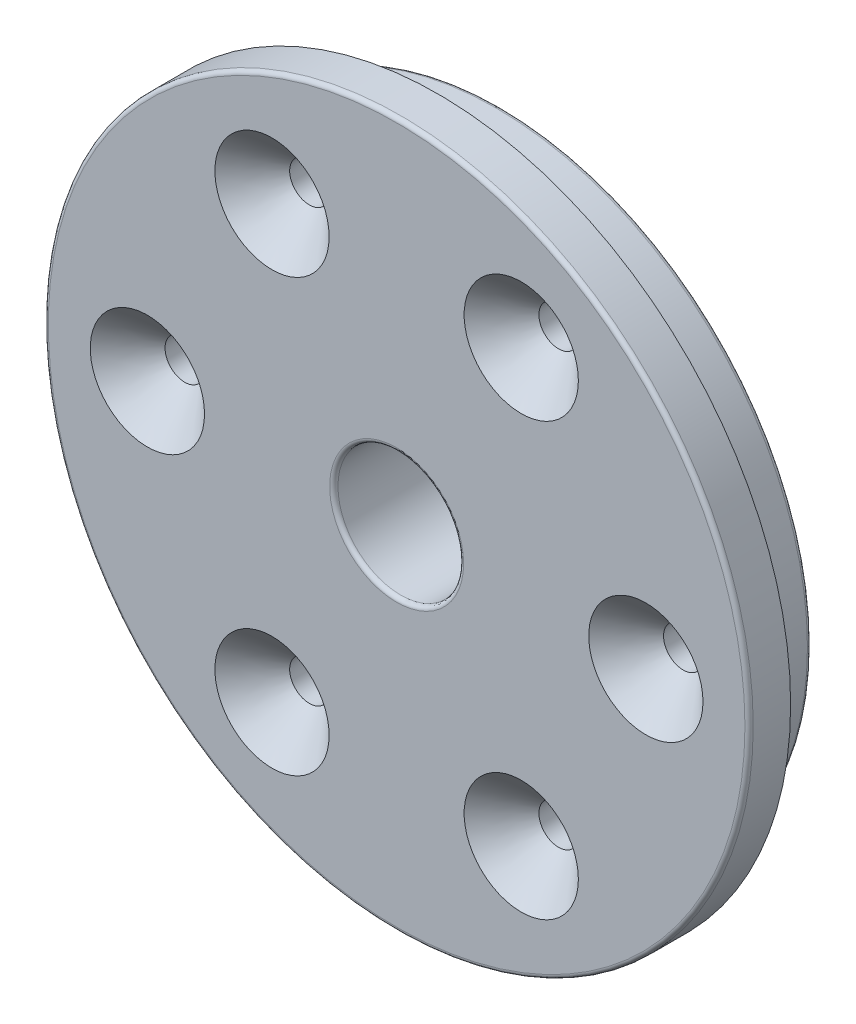
ISO-10303-21;
HEADER;
FILE_DESCRIPTION(('STEP AP214'),'2;1');
FILE_NAME('part.step','',(''),(''),'','','');
FILE_SCHEMA(('AUTOMOTIVE_DESIGN { 1 0 10303 214 1 1 1 1 }'));
ENDSEC;
DATA;
#1=APPLICATION_CONTEXT('core data for automotive mechanical design processes');
#2=APPLICATION_PROTOCOL_DEFINITION('international standard','automotive_design',2000,#1);
#3=PRODUCT_CONTEXT('',#1,'mechanical');
#4=PRODUCT('Part','Part','',(#3));
#5=PRODUCT_RELATED_PRODUCT_CATEGORY('part','',(#4));
#6=PRODUCT_DEFINITION_FORMATION('','',#4);
#7=PRODUCT_DEFINITION_CONTEXT('part definition',#1,'design');
#8=PRODUCT_DEFINITION('design','',#6,#7);
#9=PRODUCT_DEFINITION_SHAPE('','',#8);
#10=(LENGTH_UNIT() NAMED_UNIT(*) SI_UNIT(.MILLI.,.METRE.));
#11=(NAMED_UNIT(*) PLANE_ANGLE_UNIT() SI_UNIT($,.RADIAN.));
#12=(NAMED_UNIT(*) SI_UNIT($,.STERADIAN.) SOLID_ANGLE_UNIT());
#13=UNCERTAINTY_MEASURE_WITH_UNIT(LENGTH_MEASURE(1.E-05),#10,'distance_accuracy_value','');
#14=(GEOMETRIC_REPRESENTATION_CONTEXT(3) GLOBAL_UNCERTAINTY_ASSIGNED_CONTEXT((#13)) GLOBAL_UNIT_ASSIGNED_CONTEXT((#10,
#11,#12)) REPRESENTATION_CONTEXT('',''));
#15=CARTESIAN_POINT('',(0.,0.,0.));
#16=DIRECTION('',(0.,0.,1.));
#17=DIRECTION('',(1.,0.,0.));
#18=AXIS2_PLACEMENT_3D('',#15,#16,#17);
#19=CARTESIAN_POINT('',(-1.52778825225459E-13,-3.47433303373388E-13,-3.00000000000001));
#20=DIRECTION('',(0.,0.,1.));
#21=DIRECTION('',(-0.866025403784419,-0.500000000000035,0.));
#22=AXIS2_PLACEMENT_3D('',#19,#20,#21);
#23=PLANE('',#22);
#24=CARTESIAN_POINT('',(-4.57557305574691E-13,2.35632376440283E-13,-3.00000000000001));
#25=DIRECTION('',(0.,0.,1.));
#26=DIRECTION('',(0.,-1.,0.));
#27=AXIS2_PLACEMENT_3D('',#24,#25,#26);
#28=CIRCLE('',#27,14.78);
#29=CARTESIAN_POINT('',(-4.57557305574691E-13,-14.7799999999998,-3.00000000000001));
#30=VERTEX_POINT('',#29);
#31=EDGE_CURVE('E10',#30,#30,#28,.F.);
#32=ORIENTED_EDGE('',*,*,#31,.T.);
#33=EDGE_LOOP('',(#32));
#34=FACE_BOUND('',#33,.T.);
#35=CARTESIAN_POINT('',(-6.00000000000097,10.3923048454132,-3.00000000000002));
#36=DIRECTION('',(0.,0.,1.));
#37=DIRECTION('',(0.,-1.,0.));
#38=AXIS2_PLACEMENT_3D('',#35,#36,#37);
#39=CIRCLE('',#38,0.95);
#40=CARTESIAN_POINT('',(-6.00000000000097,9.4423048454132,-3.00000000000002));
#41=VERTEX_POINT('',#40);
#42=EDGE_CURVE('E117',#41,#41,#39,.T.);
#43=ORIENTED_EDGE('',*,*,#42,.T.);
#44=EDGE_LOOP('',(#43));
#45=FACE_BOUND('',#44,.T.);
#46=CARTESIAN_POINT('',(-12.0000000000005,-2.14238349283136E-13,-3.00000000000002));
#47=DIRECTION('',(0.,0.,1.));
#48=DIRECTION('',(0.,-1.,0.));
#49=AXIS2_PLACEMENT_3D('',#46,#47,#48);
#50=CIRCLE('',#49,0.949999999999999);
#51=CARTESIAN_POINT('',(-12.0000000000005,-0.950000000000213,-3.00000000000002));
#52=VERTEX_POINT('',#51);
#53=EDGE_CURVE('E130',#52,#52,#50,.T.);
#54=ORIENTED_EDGE('',*,*,#53,.T.);
#55=EDGE_LOOP('',(#54));
#56=FACE_BOUND('',#55,.T.);
#57=CARTESIAN_POINT('',(-6.00000000000004,-10.3923048454133,-3.00000000000002));
#58=DIRECTION('',(0.,0.,1.));
#59=DIRECTION('',(0.,-1.,0.));
#60=AXIS2_PLACEMENT_3D('',#57,#58,#59);
#61=CIRCLE('',#60,0.949999999999999);
#62=CARTESIAN_POINT('',(-6.00000000000004,-11.3423048454133,-3.00000000000002));
#63=VERTEX_POINT('',#62);
#64=EDGE_CURVE('E127',#63,#63,#61,.T.);
#65=ORIENTED_EDGE('',*,*,#64,.T.);
#66=EDGE_LOOP('',(#65));
#67=FACE_BOUND('',#66,.T.);
#68=CARTESIAN_POINT('',(5.99999999999998,-10.3923048454128,-3.00000000000002));
#69=DIRECTION('',(0.,0.,1.));
#70=DIRECTION('',(0.,-1.,0.));
#71=AXIS2_PLACEMENT_3D('',#68,#69,#70);
#72=CIRCLE('',#71,0.95);
#73=CARTESIAN_POINT('',(5.99999999999998,-11.3423048454128,-3.00000000000002));
#74=VERTEX_POINT('',#73);
#75=EDGE_CURVE('E124',#74,#74,#72,.T.);
#76=ORIENTED_EDGE('',*,*,#75,.T.);
#77=EDGE_LOOP('',(#76));
#78=FACE_BOUND('',#77,.T.);
#79=CARTESIAN_POINT('',(11.9999999999995,7.71951946809679E-13,-3.00000000000002));
#80=DIRECTION('',(0.,0.,1.));
#81=DIRECTION('',(0.,-1.,0.));
#82=AXIS2_PLACEMENT_3D('',#79,#80,#81);
#83=CIRCLE('',#82,0.949999999999999);
#84=CARTESIAN_POINT('',(11.9999999999995,-0.949999999999227,-3.00000000000002));
#85=VERTEX_POINT('',#84);
#86=EDGE_CURVE('E121',#85,#85,#83,.T.);
#87=ORIENTED_EDGE('',*,*,#86,.T.);
#88=EDGE_LOOP('',(#87));
#89=FACE_BOUND('',#88,.T.);
#90=CARTESIAN_POINT('',(5.99999999999905,10.3923048454138,-3.00000000000002));
#91=DIRECTION('',(0.,0.,1.));
#92=DIRECTION('',(0.,-1.,0.));
#93=AXIS2_PLACEMENT_3D('',#90,#91,#92);
#94=CIRCLE('',#93,0.950000000000001);
#95=CARTESIAN_POINT('',(5.99999999999905,9.44230484541378,-3.00000000000002));
#96=VERTEX_POINT('',#95);
#97=EDGE_CURVE('E118',#96,#96,#94,.T.);
#98=ORIENTED_EDGE('',*,*,#97,.T.);
#99=EDGE_LOOP('',(#98));
#100=FACE_BOUND('',#99,.T.);
#101=CARTESIAN_POINT('',(0.,0.,-3.00000000000001));
#102=DIRECTION('',(0.,0.,1.));
#103=DIRECTION('',(0.,-1.,0.));
#104=AXIS2_PLACEMENT_3D('',#101,#102,#103);
#105=CIRCLE('',#104,5.025);
#106=CARTESIAN_POINT('',(0.,-5.025,-3.00000000000001));
#107=VERTEX_POINT('',#106);
#108=EDGE_CURVE('E75',#107,#107,#105,.F.);
#109=ORIENTED_EDGE('',*,*,#108,.F.);
#110=EDGE_LOOP('',(#109));
#111=FACE_BOUND('',#110,.T.);
#112=ADVANCED_FACE('F31',(#34,#45,#56,#67,#78,#89,#100,#111),#23,.F.);
#113=CARTESIAN_POINT('',(0.,0.,2.));
#114=DIRECTION('',(0.,0.,1.));
#115=DIRECTION('',(1.,0.,0.));
#116=AXIS2_PLACEMENT_3D('',#113,#114,#115);
#117=PLANE('',#116);
#118=CARTESIAN_POINT('',(0.,0.,2.));
#119=DIRECTION('',(0.,0.,1.));
#120=DIRECTION('',(1.,0.,0.));
#121=AXIS2_PLACEMENT_3D('',#118,#119,#120);
#122=CIRCLE('',#121,3.225);
#123=CARTESIAN_POINT('',(3.225,0.,2.));
#124=VERTEX_POINT('',#123);
#125=EDGE_CURVE('E46',#124,#124,#122,.F.);
#126=ORIENTED_EDGE('',*,*,#125,.T.);
#127=EDGE_LOOP('',(#126));
#128=FACE_BOUND('',#127,.T.);
#129=CARTESIAN_POINT('',(0.,0.,2.));
#130=DIRECTION('',(0.,0.,1.));
#131=DIRECTION('',(1.,0.,0.));
#132=AXIS2_PLACEMENT_3D('',#129,#130,#131);
#133=CIRCLE('',#132,16.77);
#134=CARTESIAN_POINT('',(16.77,0.,2.));
#135=VERTEX_POINT('',#134);
#136=EDGE_CURVE('E51',#135,#135,#133,.T.);
#137=ORIENTED_EDGE('',*,*,#136,.T.);
#138=EDGE_LOOP('',(#137));
#139=FACE_BOUND('',#138,.T.);
#140=CARTESIAN_POINT('',(-5.99999999999971,-10.3923048454136,2.));
#141=DIRECTION('',(0.,0.,1.));
#142=DIRECTION('',(1.,0.,0.));
#143=AXIS2_PLACEMENT_3D('',#140,#141,#142);
#144=CIRCLE('',#143,2.75000000000001);
#145=CARTESIAN_POINT('',(-3.2499999999997,-10.3923048454136,2.));
#146=VERTEX_POINT('',#145);
#147=EDGE_CURVE('E93',#146,#146,#144,.F.);
#148=ORIENTED_EDGE('',*,*,#147,.T.);
#149=EDGE_LOOP('',(#148));
#150=FACE_BOUND('',#149,.T.);
#151=CARTESIAN_POINT('',(-11.9999999999997,-3.0159894831303E-13,2.));
#152=DIRECTION('',(0.,0.,1.));
#153=DIRECTION('',(1.,0.,0.));
#154=AXIS2_PLACEMENT_3D('',#151,#152,#153);
#155=CIRCLE('',#154,2.75000000000002);
#156=CARTESIAN_POINT('',(-9.24999999999971,-3.0159894831303E-13,2.));
#157=VERTEX_POINT('',#156);
#158=EDGE_CURVE('E96',#157,#157,#155,.F.);
#159=ORIENTED_EDGE('',*,*,#158,.T.);
#160=EDGE_LOOP('',(#159));
#161=FACE_BOUND('',#160,.T.);
#162=CARTESIAN_POINT('',(-5.99999999999969,10.392304845413,2.));
#163=DIRECTION('',(0.,0.,1.));
#164=DIRECTION('',(1.,0.,0.));
#165=AXIS2_PLACEMENT_3D('',#162,#163,#164);
#166=CIRCLE('',#165,2.75000000000002);
#167=CARTESIAN_POINT('',(-3.24999999999968,10.392304845413,2.));
#168=VERTEX_POINT('',#167);
#169=EDGE_CURVE('E99',#168,#168,#166,.F.);
#170=ORIENTED_EDGE('',*,*,#169,.T.);
#171=EDGE_LOOP('',(#170));
#172=FACE_BOUND('',#171,.T.);
#173=CARTESIAN_POINT('',(6.00000000000033,10.3923048454129,2.));
#174=DIRECTION('',(0.,0.,1.));
#175=DIRECTION('',(1.,0.,0.));
#176=AXIS2_PLACEMENT_3D('',#173,#174,#175);
#177=CIRCLE('',#176,2.75);
#178=CARTESIAN_POINT('',(8.75000000000033,10.3923048454129,2.));
#179=VERTEX_POINT('',#178);
#180=EDGE_CURVE('E102',#179,#179,#177,.F.);
#181=ORIENTED_EDGE('',*,*,#180,.T.);
#182=EDGE_LOOP('',(#181));
#183=FACE_BOUND('',#182,.T.);
#184=CARTESIAN_POINT('',(6.00000000000031,-10.3923048454136,2.));
#185=DIRECTION('',(0.,0.,1.));
#186=DIRECTION('',(1.,0.,0.));
#187=AXIS2_PLACEMENT_3D('',#184,#185,#186);
#188=CIRCLE('',#187,2.75000000000002);
#189=CARTESIAN_POINT('',(8.75000000000032,-10.3923048454136,2.));
#190=VERTEX_POINT('',#189);
#191=EDGE_CURVE('E105',#190,#190,#188,.F.);
#192=ORIENTED_EDGE('',*,*,#191,.T.);
#193=EDGE_LOOP('',(#192));
#194=FACE_BOUND('',#193,.T.);
#195=CARTESIAN_POINT('',(12.0000000000003,-2.39105950906385E-13,2.));
#196=DIRECTION('',(0.,0.,1.));
#197=DIRECTION('',(1.,0.,0.));
#198=AXIS2_PLACEMENT_3D('',#195,#196,#197);
#199=CIRCLE('',#198,2.75000000000001);
#200=CARTESIAN_POINT('',(14.7500000000003,-2.39105950906385E-13,2.));
#201=VERTEX_POINT('',#200);
#202=EDGE_CURVE('E108',#201,#201,#199,.F.);
#203=ORIENTED_EDGE('',*,*,#202,.T.);
#204=EDGE_LOOP('',(#203));
#205=FACE_BOUND('',#204,.T.);
#206=ADVANCED_FACE('F155',(#128,#139,#150,#161,#172,#183,#194,#205),#117,.T.);
#207=CARTESIAN_POINT('',(0.,0.,0.));
#208=DIRECTION('',(0.,0.,1.));
#209=DIRECTION('',(1.,0.,0.));
#210=AXIS2_PLACEMENT_3D('',#207,#208,#209);
#211=PLANE('',#210);
#212=CARTESIAN_POINT('',(-4.57558601988791E-13,2.35627233196304E-13,0.));
#213=DIRECTION('',(0.,0.,1.));
#214=DIRECTION('',(1.,0.,0.));
#215=AXIS2_PLACEMENT_3D('',#212,#213,#214);
#216=CIRCLE('',#215,15.18);
#217=CARTESIAN_POINT('',(15.1799999999996,2.35627233196304E-13,0.));
#218=VERTEX_POINT('',#217);
#219=EDGE_CURVE('E69',#218,#218,#216,.T.);
#220=ORIENTED_EDGE('',*,*,#219,.T.);
#221=EDGE_LOOP('',(#220));
#222=FACE_BOUND('',#221,.T.);
#223=CARTESIAN_POINT('',(0.,0.,0.));
#224=DIRECTION('',(0.,0.,1.));
#225=DIRECTION('',(1.,0.,0.));
#226=AXIS2_PLACEMENT_3D('',#223,#224,#225);
#227=CIRCLE('',#226,16.97);
#228=CARTESIAN_POINT('',(16.97,0.,0.));
#229=VERTEX_POINT('',#228);
#230=EDGE_CURVE('E114',#229,#229,#227,.T.);
#231=ORIENTED_EDGE('',*,*,#230,.F.);
#232=EDGE_LOOP('',(#231));
#233=FACE_BOUND('',#232,.T.);
#234=ADVANCED_FACE('F160',(#222,#233),#211,.F.);
#235=CARTESIAN_POINT('',(0.,0.,2.));
#236=DIRECTION('',(0.,0.,-1.));
#237=DIRECTION('',(-1.,0.,0.));
#238=AXIS2_PLACEMENT_3D('',#235,#236,#237);
#239=CYLINDRICAL_SURFACE('',#238,16.97);
#240=CARTESIAN_POINT('',(0.,0.,1.8));
#241=DIRECTION('',(0.,0.,1.));
#242=DIRECTION('',(1.,0.,0.));
#243=AXIS2_PLACEMENT_3D('',#240,#241,#242);
#244=CIRCLE('',#243,16.97);
#245=CARTESIAN_POINT('',(16.97,0.,1.8));
#246=VERTEX_POINT('',#245);
#247=EDGE_CURVE('E42',#246,#246,#244,.F.);
#248=ORIENTED_EDGE('',*,*,#247,.T.);
#249=EDGE_LOOP('',(#248));
#250=FACE_BOUND('',#249,.T.);
#251=ORIENTED_EDGE('',*,*,#230,.T.);
#252=EDGE_LOOP('',(#251));
#253=FACE_BOUND('',#252,.T.);
#254=ADVANCED_FACE('F151',(#250,#253),#239,.T.);
#255=CARTESIAN_POINT('',(-11.9999999999997,-3.0159894831303E-13,2.));
#256=DIRECTION('',(0.,0.,-1.));
#257=DIRECTION('',(-1.,0.,0.));
#258=AXIS2_PLACEMENT_3D('',#255,#256,#257);
#259=CYLINDRICAL_SURFACE('',#258,0.949999999999999);
#260=CARTESIAN_POINT('',(-11.9999999999997,-3.0159894831303E-13,0.199999999999994));
#261=DIRECTION('',(0.,0.,1.));
#262=DIRECTION('',(1.,0.,0.));
#263=AXIS2_PLACEMENT_3D('',#260,#261,#262);
#264=CIRCLE('',#263,0.949999999999999);
#265=CARTESIAN_POINT('',(-11.0499999999997,-3.0159894831303E-13,0.199999999999994));
#266=VERTEX_POINT('',#265);
#267=EDGE_CURVE('E90',#266,#266,#264,.T.);
#268=ORIENTED_EDGE('',*,*,#267,.T.);
#269=EDGE_LOOP('',(#268));
#270=FACE_BOUND('',#269,.T.);
#271=ORIENTED_EDGE('',*,*,#53,.F.);
#272=EDGE_LOOP('',(#271));
#273=FACE_BOUND('',#272,.T.);
#274=ADVANCED_FACE('F141',(#270,#273),#259,.F.);
#275=CARTESIAN_POINT('',(-5.99999999999969,10.392304845413,2.));
#276=DIRECTION('',(0.,0.,-1.));
#277=DIRECTION('',(-1.,0.,0.));
#278=AXIS2_PLACEMENT_3D('',#275,#276,#277);
#279=CYLINDRICAL_SURFACE('',#278,0.949999999999999);
#280=CARTESIAN_POINT('',(-5.99999999999969,10.392304845413,0.199999999999994));
#281=DIRECTION('',(0.,0.,1.));
#282=DIRECTION('',(1.,0.,0.));
#283=AXIS2_PLACEMENT_3D('',#280,#281,#282);
#284=CIRCLE('',#283,0.949999999999999);
#285=CARTESIAN_POINT('',(-5.0499999999997,10.392304845413,0.199999999999994));
#286=VERTEX_POINT('',#285);
#287=EDGE_CURVE('E87',#286,#286,#284,.T.);
#288=ORIENTED_EDGE('',*,*,#287,.T.);
#289=EDGE_LOOP('',(#288));
#290=FACE_BOUND('',#289,.T.);
#291=ORIENTED_EDGE('',*,*,#42,.F.);
#292=EDGE_LOOP('',(#291));
#293=FACE_BOUND('',#292,.T.);
#294=ADVANCED_FACE('F138',(#290,#293),#279,.F.);
#295=CARTESIAN_POINT('',(6.00000000000033,10.3923048454129,2.));
#296=DIRECTION('',(0.,0.,-1.));
#297=DIRECTION('',(-1.,0.,0.));
#298=AXIS2_PLACEMENT_3D('',#295,#296,#297);
#299=CYLINDRICAL_SURFACE('',#298,0.949999999999998);
#300=CARTESIAN_POINT('',(6.00000000000033,10.3923048454129,0.2));
#301=DIRECTION('',(0.,0.,1.));
#302=DIRECTION('',(1.,0.,0.));
#303=AXIS2_PLACEMENT_3D('',#300,#301,#302);
#304=CIRCLE('',#303,0.949999999999998);
#305=CARTESIAN_POINT('',(6.95000000000033,10.3923048454129,0.2));
#306=VERTEX_POINT('',#305);
#307=EDGE_CURVE('E84',#306,#306,#304,.T.);
#308=ORIENTED_EDGE('',*,*,#307,.T.);
#309=EDGE_LOOP('',(#308));
#310=FACE_BOUND('',#309,.T.);
#311=ORIENTED_EDGE('',*,*,#97,.F.);
#312=EDGE_LOOP('',(#311));
#313=FACE_BOUND('',#312,.T.);
#314=ADVANCED_FACE('F140',(#310,#313),#299,.F.);
#315=CARTESIAN_POINT('',(12.0000000000003,-2.39105950906385E-13,2.));
#316=DIRECTION('',(0.,0.,-1.));
#317=DIRECTION('',(-1.,0.,0.));
#318=AXIS2_PLACEMENT_3D('',#315,#316,#317);
#319=CYLINDRICAL_SURFACE('',#318,0.949999999999999);
#320=CARTESIAN_POINT('',(12.0000000000003,-2.39105950906385E-13,0.200000000000001));
#321=DIRECTION('',(0.,0.,1.));
#322=DIRECTION('',(1.,0.,0.));
#323=AXIS2_PLACEMENT_3D('',#320,#321,#322);
#324=CIRCLE('',#323,0.949999999999999);
#325=CARTESIAN_POINT('',(12.9500000000003,-2.39105950906385E-13,0.200000000000001));
#326=VERTEX_POINT('',#325);
#327=EDGE_CURVE('E78',#326,#326,#324,.T.);
#328=ORIENTED_EDGE('',*,*,#327,.T.);
#329=EDGE_LOOP('',(#328));
#330=FACE_BOUND('',#329,.T.);
#331=ORIENTED_EDGE('',*,*,#86,.F.);
#332=EDGE_LOOP('',(#331));
#333=FACE_BOUND('',#332,.T.);
#334=ADVANCED_FACE('F148',(#330,#333),#319,.F.);
#335=CARTESIAN_POINT('',(-5.99999999999971,-10.3923048454136,2.));
#336=DIRECTION('',(0.,0.,-1.));
#337=DIRECTION('',(-1.,0.,0.));
#338=AXIS2_PLACEMENT_3D('',#335,#336,#337);
#339=CYLINDRICAL_SURFACE('',#338,0.949999999999997);
#340=CARTESIAN_POINT('',(-5.99999999999971,-10.3923048454136,0.199999999999999));
#341=DIRECTION('',(0.,0.,1.));
#342=DIRECTION('',(1.,0.,0.));
#343=AXIS2_PLACEMENT_3D('',#340,#341,#342);
#344=CIRCLE('',#343,0.949999999999997);
#345=CARTESIAN_POINT('',(-5.04999999999972,-10.3923048454136,0.199999999999999));
#346=VERTEX_POINT('',#345);
#347=EDGE_CURVE('E111',#346,#346,#344,.T.);
#348=ORIENTED_EDGE('',*,*,#347,.T.);
#349=EDGE_LOOP('',(#348));
#350=FACE_BOUND('',#349,.T.);
#351=ORIENTED_EDGE('',*,*,#64,.F.);
#352=EDGE_LOOP('',(#351));
#353=FACE_BOUND('',#352,.T.);
#354=ADVANCED_FACE('F174',(#350,#353),#339,.F.);
#355=CARTESIAN_POINT('',(6.00000000000031,-10.3923048454136,2.));
#356=DIRECTION('',(0.,0.,-1.));
#357=DIRECTION('',(-1.,0.,0.));
#358=AXIS2_PLACEMENT_3D('',#355,#356,#357);
#359=CYLINDRICAL_SURFACE('',#358,0.950000000000001);
#360=CARTESIAN_POINT('',(6.00000000000031,-10.3923048454136,0.199999999999996));
#361=DIRECTION('',(0.,0.,1.));
#362=DIRECTION('',(1.,0.,0.));
#363=AXIS2_PLACEMENT_3D('',#360,#361,#362);
#364=CIRCLE('',#363,0.950000000000001);
#365=CARTESIAN_POINT('',(6.95000000000031,-10.3923048454136,0.199999999999996));
#366=VERTEX_POINT('',#365);
#367=EDGE_CURVE('E81',#366,#366,#364,.T.);
#368=ORIENTED_EDGE('',*,*,#367,.T.);
#369=EDGE_LOOP('',(#368));
#370=FACE_BOUND('',#369,.T.);
#371=ORIENTED_EDGE('',*,*,#75,.F.);
#372=EDGE_LOOP('',(#371));
#373=FACE_BOUND('',#372,.T.);
#374=ADVANCED_FACE('F170',(#370,#373),#359,.F.);
#375=CARTESIAN_POINT('',(0.,0.,2.));
#376=DIRECTION('',(0.,0.,-1.));
#377=DIRECTION('',(-1.,0.,0.));
#378=AXIS2_PLACEMENT_3D('',#375,#376,#377);
#379=CYLINDRICAL_SURFACE('',#378,3.025);
#380=CARTESIAN_POINT('',(0.,0.,-7.80000000000001));
#381=DIRECTION('',(0.,0.,-1.));
#382=DIRECTION('',(-1.,0.,0.));
#383=AXIS2_PLACEMENT_3D('',#380,#381,#382);
#384=CIRCLE('',#383,3.025);
#385=CARTESIAN_POINT('',(-3.025,0.,-7.80000000000001));
#386=VERTEX_POINT('',#385);
#387=EDGE_CURVE('E54',#386,#386,#384,.T.);
#388=ORIENTED_EDGE('',*,*,#387,.T.);
#389=EDGE_LOOP('',(#388));
#390=FACE_BOUND('',#389,.T.);
#391=CARTESIAN_POINT('',(0.,0.,1.8));
#392=DIRECTION('',(0.,0.,1.));
#393=DIRECTION('',(1.,0.,0.));
#394=AXIS2_PLACEMENT_3D('',#391,#392,#393);
#395=CIRCLE('',#394,3.025);
#396=CARTESIAN_POINT('',(3.025,0.,1.8));
#397=VERTEX_POINT('',#396);
#398=EDGE_CURVE('E57',#397,#397,#395,.T.);
#399=ORIENTED_EDGE('',*,*,#398,.T.);
#400=EDGE_LOOP('',(#399));
#401=FACE_BOUND('',#400,.T.);
#402=ADVANCED_FACE('F167',(#390,#401),#379,.F.);
#403=CARTESIAN_POINT('',(-4.57558601988791E-13,2.35627233196304E-13,-45.369838328698));
#404=DIRECTION('',(0.,0.,1.));
#405=DIRECTION('',(1.,0.,0.));
#406=AXIS2_PLACEMENT_3D('',#403,#404,#405);
#407=CYLINDRICAL_SURFACE('',#406,14.98);
#408=CARTESIAN_POINT('',(-4.57558601988791E-13,2.35627233196304E-13,-2.80000000000001));
#409=DIRECTION('',(0.,0.,1.));
#410=DIRECTION('',(0.,-1.,0.));
#411=AXIS2_PLACEMENT_3D('',#408,#409,#410);
#412=CIRCLE('',#411,14.98);
#413=CARTESIAN_POINT('',(-4.57558601988791E-13,-14.9799999999998,-2.80000000000001));
#414=VERTEX_POINT('',#413);
#415=EDGE_CURVE('E38',#414,#414,#412,.T.);
#416=ORIENTED_EDGE('',*,*,#415,.T.);
#417=EDGE_LOOP('',(#416));
#418=FACE_BOUND('',#417,.T.);
#419=CARTESIAN_POINT('',(-4.57558601988791E-13,2.35627233196304E-13,-0.199999999999999));
#420=DIRECTION('',(0.,0.,1.));
#421=DIRECTION('',(1.,0.,0.));
#422=AXIS2_PLACEMENT_3D('',#419,#420,#421);
#423=CIRCLE('',#422,14.98);
#424=CARTESIAN_POINT('',(14.9799999999995,2.35627233196304E-13,-0.199999999999999));
#425=VERTEX_POINT('',#424);
#426=EDGE_CURVE('E72',#425,#425,#423,.F.);
#427=ORIENTED_EDGE('',*,*,#426,.T.);
#428=EDGE_LOOP('',(#427));
#429=FACE_BOUND('',#428,.T.);
#430=ADVANCED_FACE('F165',(#418,#429),#407,.T.);
#431=CARTESIAN_POINT('',(-5.99999999999971,-10.3923048454136,0.199999999999999));
#432=DIRECTION('',(0.,0.,1.));
#433=DIRECTION('',(1.,0.,0.));
#434=AXIS2_PLACEMENT_3D('',#431,#432,#433);
#435=CONICAL_SURFACE('',#434,0.949999999999997,0.785398163397451);
#436=ORIENTED_EDGE('',*,*,#147,.F.);
#437=EDGE_LOOP('',(#436));
#438=FACE_BOUND('',#437,.T.);
#439=ORIENTED_EDGE('',*,*,#347,.F.);
#440=EDGE_LOOP('',(#439));
#441=FACE_BOUND('',#440,.T.);
#442=ADVANCED_FACE('F253',(#438,#441),#435,.F.);
#443=CARTESIAN_POINT('',(-11.9999999999997,-3.0159894831303E-13,0.199999999999994));
#444=DIRECTION('',(0.,0.,1.));
#445=DIRECTION('',(1.,0.,0.));
#446=AXIS2_PLACEMENT_3D('',#443,#444,#445);
#447=CONICAL_SURFACE('',#446,0.949999999999999,0.785398163397451);
#448=ORIENTED_EDGE('',*,*,#158,.F.);
#449=EDGE_LOOP('',(#448));
#450=FACE_BOUND('',#449,.T.);
#451=ORIENTED_EDGE('',*,*,#267,.F.);
#452=EDGE_LOOP('',(#451));
#453=FACE_BOUND('',#452,.T.);
#454=ADVANCED_FACE('F249',(#450,#453),#447,.F.);
#455=CARTESIAN_POINT('',(-5.99999999999969,10.392304845413,0.199999999999994));
#456=DIRECTION('',(0.,0.,1.));
#457=DIRECTION('',(1.,0.,0.));
#458=AXIS2_PLACEMENT_3D('',#455,#456,#457);
#459=CONICAL_SURFACE('',#458,0.949999999999999,0.785398163397451);
#460=ORIENTED_EDGE('',*,*,#169,.F.);
#461=EDGE_LOOP('',(#460));
#462=FACE_BOUND('',#461,.T.);
#463=ORIENTED_EDGE('',*,*,#287,.F.);
#464=EDGE_LOOP('',(#463));
#465=FACE_BOUND('',#464,.T.);
#466=ADVANCED_FACE('F245',(#462,#465),#459,.F.);
#467=CARTESIAN_POINT('',(6.00000000000033,10.3923048454129,0.2));
#468=DIRECTION('',(0.,0.,1.));
#469=DIRECTION('',(1.,0.,0.));
#470=AXIS2_PLACEMENT_3D('',#467,#468,#469);
#471=CONICAL_SURFACE('',#470,0.949999999999998,0.78539816339745);
#472=ORIENTED_EDGE('',*,*,#180,.F.);
#473=EDGE_LOOP('',(#472));
#474=FACE_BOUND('',#473,.T.);
#475=ORIENTED_EDGE('',*,*,#307,.F.);
#476=EDGE_LOOP('',(#475));
#477=FACE_BOUND('',#476,.T.);
#478=ADVANCED_FACE('F241',(#474,#477),#471,.F.);
#479=CARTESIAN_POINT('',(6.00000000000031,-10.3923048454136,0.199999999999996));
#480=DIRECTION('',(0.,0.,1.));
#481=DIRECTION('',(1.,0.,0.));
#482=AXIS2_PLACEMENT_3D('',#479,#480,#481);
#483=CONICAL_SURFACE('',#482,0.950000000000001,0.785398163397451);
#484=CARTESIAN_POINT('',(8.75000000000032,-10.3923048454136,2.));
#485=CARTESIAN_POINT('',(8.73125000000032,-10.3923048454136,1.98125));
#486=CARTESIAN_POINT('',(8.71250000000032,-10.3923048454136,1.9625));
#487=CARTESIAN_POINT('',(8.67500000000032,-10.3923048454136,1.925));
#488=CARTESIAN_POINT('',(8.65625000000032,-10.3923048454136,1.90625));
#489=CARTESIAN_POINT('',(8.61875000000032,-10.3923048454136,1.86875));
#490=CARTESIAN_POINT('',(8.60000000000032,-10.3923048454136,1.85));
#491=CARTESIAN_POINT('',(8.56250000000032,-10.3923048454136,1.8125));
#492=CARTESIAN_POINT('',(8.54375000000032,-10.3923048454136,1.79375));
#493=CARTESIAN_POINT('',(8.50625000000032,-10.3923048454136,1.75625));
#494=CARTESIAN_POINT('',(8.48750000000032,-10.3923048454136,1.7375));
#495=CARTESIAN_POINT('',(8.45000000000032,-10.3923048454136,1.7));
#496=CARTESIAN_POINT('',(8.43125000000032,-10.3923048454136,1.68125));
#497=CARTESIAN_POINT('',(8.39375000000032,-10.3923048454136,1.64375));
#498=CARTESIAN_POINT('',(8.37500000000032,-10.3923048454136,1.625));
#499=CARTESIAN_POINT('',(8.33750000000032,-10.3923048454136,1.5875));
#500=CARTESIAN_POINT('',(8.31875000000032,-10.3923048454136,1.56875));
#501=CARTESIAN_POINT('',(8.28125000000032,-10.3923048454136,1.53125));
#502=CARTESIAN_POINT('',(8.26250000000032,-10.3923048454136,1.5125));
#503=CARTESIAN_POINT('',(8.22500000000032,-10.3923048454136,1.475));
#504=CARTESIAN_POINT('',(8.20625000000032,-10.3923048454136,1.45625));
#505=CARTESIAN_POINT('',(8.16875000000032,-10.3923048454136,1.41875));
#506=CARTESIAN_POINT('',(8.15000000000032,-10.3923048454136,1.4));
#507=CARTESIAN_POINT('',(8.11250000000032,-10.3923048454136,1.3625));
#508=CARTESIAN_POINT('',(8.09375000000032,-10.3923048454136,1.34375));
#509=CARTESIAN_POINT('',(8.05625000000032,-10.3923048454136,1.30625));
#510=CARTESIAN_POINT('',(8.03750000000032,-10.3923048454136,1.2875));
#511=CARTESIAN_POINT('',(8.00000000000032,-10.3923048454136,1.25));
#512=CARTESIAN_POINT('',(7.98125000000032,-10.3923048454136,1.23125));
#513=CARTESIAN_POINT('',(7.94375000000032,-10.3923048454136,1.19375));
#514=CARTESIAN_POINT('',(7.92500000000032,-10.3923048454136,1.175));
#515=CARTESIAN_POINT('',(7.88750000000032,-10.3923048454136,1.1375));
#516=CARTESIAN_POINT('',(7.86875000000031,-10.3923048454136,1.11875));
#517=CARTESIAN_POINT('',(7.83125000000032,-10.3923048454136,1.08125));
#518=CARTESIAN_POINT('',(7.81250000000031,-10.3923048454136,1.0625));
#519=CARTESIAN_POINT('',(7.77500000000031,-10.3923048454136,1.025));
#520=CARTESIAN_POINT('',(7.75625000000031,-10.3923048454136,1.00625));
#521=CARTESIAN_POINT('',(7.71875000000031,-10.3923048454136,0.968749999999997));
#522=CARTESIAN_POINT('',(7.70000000000031,-10.3923048454136,0.949999999999997));
#523=CARTESIAN_POINT('',(7.66250000000031,-10.3923048454136,0.912499999999997));
#524=CARTESIAN_POINT('',(7.64375000000031,-10.3923048454136,0.893749999999997));
#525=CARTESIAN_POINT('',(7.60625000000031,-10.3923048454136,0.856249999999997));
#526=CARTESIAN_POINT('',(7.58750000000031,-10.3923048454136,0.837499999999997));
#527=CARTESIAN_POINT('',(7.55000000000031,-10.3923048454136,0.799999999999997));
#528=CARTESIAN_POINT('',(7.53125000000031,-10.3923048454136,0.781249999999997));
#529=CARTESIAN_POINT('',(7.49375000000031,-10.3923048454136,0.743749999999997));
#530=CARTESIAN_POINT('',(7.47500000000031,-10.3923048454136,0.724999999999997));
#531=CARTESIAN_POINT('',(7.43750000000031,-10.3923048454136,0.687499999999997));
#532=CARTESIAN_POINT('',(7.41875000000031,-10.3923048454136,0.668749999999997));
#533=CARTESIAN_POINT('',(7.38125000000031,-10.3923048454136,0.631249999999997));
#534=CARTESIAN_POINT('',(7.36250000000031,-10.3923048454136,0.612499999999997));
#535=CARTESIAN_POINT('',(7.32500000000031,-10.3923048454136,0.574999999999997));
#536=CARTESIAN_POINT('',(7.30625000000031,-10.3923048454136,0.556249999999997));
#537=CARTESIAN_POINT('',(7.26875000000031,-10.3923048454136,0.518749999999996));
#538=CARTESIAN_POINT('',(7.25000000000031,-10.3923048454136,0.499999999999996));
#539=CARTESIAN_POINT('',(7.21250000000031,-10.3923048454136,0.462499999999996));
#540=CARTESIAN_POINT('',(7.19375000000031,-10.3923048454136,0.443749999999996));
#541=CARTESIAN_POINT('',(7.15625000000031,-10.3923048454136,0.406249999999996));
#542=CARTESIAN_POINT('',(7.13750000000031,-10.3923048454136,0.387499999999996));
#543=CARTESIAN_POINT('',(7.10000000000031,-10.3923048454136,0.349999999999996));
#544=CARTESIAN_POINT('',(7.08125000000031,-10.3923048454136,0.331249999999996));
#545=CARTESIAN_POINT('',(7.04375000000031,-10.3923048454136,0.293749999999996));
#546=CARTESIAN_POINT('',(7.02500000000031,-10.3923048454136,0.274999999999996));
#547=CARTESIAN_POINT('',(6.98750000000031,-10.3923048454136,0.237499999999996));
#548=CARTESIAN_POINT('',(6.96875000000031,-10.3923048454136,0.218749999999996));
#549=CARTESIAN_POINT('',(6.95000000000031,-10.3923048454136,0.199999999999996));
#550=B_SPLINE_CURVE_WITH_KNOTS('',3,(#484,#485,#486,#487,#488,#489,#490,#491,#492,#493,#494,
#495,#496,#497,#498,#499,#500,#501,#502,#503,#504,#505,#506,#507,#508,#509,#510,#511,#512,#513,
#514,#515,#516,#517,#518,#519,#520,#521,#522,#523,#524,#525,#526,#527,#528,#529,#530,#531,#532,
#533,#534,#535,#536,#537,#538,#539,#540,#541,#542,#543,#544,#545,#546,#547,#548,#549),
.UNSPECIFIED.,.F.,.F.,(4,2,2,2,2,2,2,2,2,2,2,2,2,2,2,2,2,2,2,2,2,2,2,2,2,2,2,2,2,2,2,2,4),(0.,
0.0795495128834873,0.159099025766975,0.238648538650462,0.318198051533949,0.397747564417436,
0.477297077300923,0.556846590184411,0.636396103067898,0.715945615951384,0.795495128834871,
0.875044641718358,0.954594154601844,1.03414366748533,1.11369318036882,1.19324269325231,
1.27279220613579,1.35234171901928,1.43189123190277,1.51144074478625,1.59099025766974,
1.67053977055323,1.75008928343671,1.8296387963202,1.90918830920369,1.98873782208718,
2.06828733497066,2.14783684785415,2.22738636073764,2.30693587362112,2.38648538650461,
2.4660348993881,2.54558441227159),.UNSPECIFIED.);
#551=EDGE_CURVE('BSEAM237',#190,#366,#550,.T.);
#552=ORIENTED_EDGE('',*,*,#191,.F.);
#553=ORIENTED_EDGE('',*,*,#367,.F.);
#554=ORIENTED_EDGE('',*,*,#551,.T.);
#555=ORIENTED_EDGE('',*,*,#551,.F.);
#556=EDGE_LOOP('',(#552,#554,#553,#555));
#557=FACE_BOUND('',#556,.T.);
#558=ADVANCED_FACE('F237',(#557),#483,.F.);
#559=CARTESIAN_POINT('',(12.0000000000003,-2.39105950906385E-13,0.200000000000001));
#560=DIRECTION('',(0.,0.,1.));
#561=DIRECTION('',(1.,0.,0.));
#562=AXIS2_PLACEMENT_3D('',#559,#560,#561);
#563=CONICAL_SURFACE('',#562,0.949999999999999,0.785398163397451);
#564=ORIENTED_EDGE('',*,*,#202,.F.);
#565=EDGE_LOOP('',(#564));
#566=FACE_BOUND('',#565,.T.);
#567=ORIENTED_EDGE('',*,*,#327,.F.);
#568=EDGE_LOOP('',(#567));
#569=FACE_BOUND('',#568,.T.);
#570=ADVANCED_FACE('F204',(#566,#569),#563,.F.);
#571=CARTESIAN_POINT('',(0.,0.,-8.00000000000001));
#572=DIRECTION('',(0.,0.,-1.));
#573=DIRECTION('',(-1.,0.,0.));
#574=AXIS2_PLACEMENT_3D('',#571,#572,#573);
#575=PLANE('',#574);
#576=CARTESIAN_POINT('',(0.,0.,-8.00000000000001));
#577=DIRECTION('',(0.,0.,-1.));
#578=DIRECTION('',(-1.,0.,0.));
#579=AXIS2_PLACEMENT_3D('',#576,#577,#578);
#580=CIRCLE('',#579,4.825);
#581=CARTESIAN_POINT('',(-4.825,0.,-8.00000000000001));
#582=VERTEX_POINT('',#581);
#583=EDGE_CURVE('E63',#582,#582,#580,.T.);
#584=ORIENTED_EDGE('',*,*,#583,.T.);
#585=EDGE_LOOP('',(#584));
#586=FACE_BOUND('',#585,.T.);
#587=CARTESIAN_POINT('',(0.,0.,-8.00000000000001));
#588=DIRECTION('',(0.,0.,-1.));
#589=DIRECTION('',(-1.,0.,0.));
#590=AXIS2_PLACEMENT_3D('',#587,#588,#589);
#591=CIRCLE('',#590,3.225);
#592=CARTESIAN_POINT('',(-3.225,0.,-8.00000000000001));
#593=VERTEX_POINT('',#592);
#594=EDGE_CURVE('E66',#593,#593,#591,.F.);
#595=ORIENTED_EDGE('',*,*,#594,.T.);
#596=EDGE_LOOP('',(#595));
#597=FACE_BOUND('',#596,.T.);
#598=ADVANCED_FACE('F195',(#586,#597),#575,.T.);
#599=CARTESIAN_POINT('',(0.,0.,-8.00000000000001));
#600=DIRECTION('',(0.,0.,1.));
#601=DIRECTION('',(1.,0.,0.));
#602=AXIS2_PLACEMENT_3D('',#599,#600,#601);
#603=CYLINDRICAL_SURFACE('',#602,5.025);
#604=CARTESIAN_POINT('',(0.,0.,-7.80000000000001));
#605=DIRECTION('',(0.,0.,-1.));
#606=DIRECTION('',(-1.,0.,0.));
#607=AXIS2_PLACEMENT_3D('',#604,#605,#606);
#608=CIRCLE('',#607,5.025);
#609=CARTESIAN_POINT('',(-5.025,0.,-7.80000000000001));
#610=VERTEX_POINT('',#609);
#611=EDGE_CURVE('E60',#610,#610,#608,.F.);
#612=ORIENTED_EDGE('',*,*,#611,.T.);
#613=EDGE_LOOP('',(#612));
#614=FACE_BOUND('',#613,.T.);
#615=ORIENTED_EDGE('',*,*,#108,.T.);
#616=EDGE_LOOP('',(#615));
#617=FACE_BOUND('',#616,.T.);
#618=ADVANCED_FACE('F192',(#614,#617),#603,.T.);
#619=CARTESIAN_POINT('',(-4.57558601988791E-13,2.35627233196304E-13,-0.199999999999999));
#620=DIRECTION('',(0.,0.,1.));
#621=DIRECTION('',(1.,0.,0.));
#622=AXIS2_PLACEMENT_3D('',#619,#620,#621);
#623=TOROIDAL_SURFACE('',#622,15.18,0.2);
#624=ORIENTED_EDGE('',*,*,#219,.F.);
#625=EDGE_LOOP('',(#624));
#626=FACE_BOUND('',#625,.T.);
#627=ORIENTED_EDGE('',*,*,#426,.F.);
#628=EDGE_LOOP('',(#627));
#629=FACE_BOUND('',#628,.T.);
#630=ADVANCED_FACE('F194',(#626,#629),#623,.F.);
#631=CARTESIAN_POINT('',(0.,0.,-7.80000000000001));
#632=DIRECTION('',(0.,0.,-1.));
#633=DIRECTION('',(-1.,0.,0.));
#634=AXIS2_PLACEMENT_3D('',#631,#632,#633);
#635=TOROIDAL_SURFACE('',#634,4.825,0.2);
#636=ORIENTED_EDGE('',*,*,#611,.F.);
#637=EDGE_LOOP('',(#636));
#638=FACE_BOUND('',#637,.T.);
#639=ORIENTED_EDGE('',*,*,#583,.F.);
#640=EDGE_LOOP('',(#639));
#641=FACE_BOUND('',#640,.T.);
#642=ADVANCED_FACE('F201',(#638,#641),#635,.T.);
#643=CARTESIAN_POINT('',(0.,0.,-7.80000000000001));
#644=DIRECTION('',(0.,0.,-1.));
#645=DIRECTION('',(-1.,0.,0.));
#646=AXIS2_PLACEMENT_3D('',#643,#644,#645);
#647=TOROIDAL_SURFACE('',#646,3.225,0.2);
#648=ORIENTED_EDGE('',*,*,#594,.F.);
#649=EDGE_LOOP('',(#648));
#650=FACE_BOUND('',#649,.T.);
#651=ORIENTED_EDGE('',*,*,#387,.F.);
#652=EDGE_LOOP('',(#651));
#653=FACE_BOUND('',#652,.T.);
#654=ADVANCED_FACE('F211',(#650,#653),#647,.T.);
#655=CARTESIAN_POINT('',(0.,0.,1.8));
#656=DIRECTION('',(0.,0.,1.));
#657=DIRECTION('',(1.,0.,0.));
#658=AXIS2_PLACEMENT_3D('',#655,#656,#657);
#659=TOROIDAL_SURFACE('',#658,3.225,0.2);
#660=ORIENTED_EDGE('',*,*,#125,.F.);
#661=EDGE_LOOP('',(#660));
#662=FACE_BOUND('',#661,.T.);
#663=ORIENTED_EDGE('',*,*,#398,.F.);
#664=EDGE_LOOP('',(#663));
#665=FACE_BOUND('',#664,.T.);
#666=ADVANCED_FACE('F219',(#662,#665),#659,.T.);
#667=CARTESIAN_POINT('',(0.,0.,1.8));
#668=DIRECTION('',(0.,0.,1.));
#669=DIRECTION('',(1.,0.,0.));
#670=AXIS2_PLACEMENT_3D('',#667,#668,#669);
#671=TOROIDAL_SURFACE('',#670,16.77,0.2);
#672=ORIENTED_EDGE('',*,*,#247,.F.);
#673=EDGE_LOOP('',(#672));
#674=FACE_BOUND('',#673,.T.);
#675=ORIENTED_EDGE('',*,*,#136,.F.);
#676=EDGE_LOOP('',(#675));
#677=FACE_BOUND('',#676,.T.);
#678=ADVANCED_FACE('F226',(#674,#677),#671,.T.);
#679=CARTESIAN_POINT('',(-4.57558601988791E-13,2.35627233196304E-13,-2.80000000000001));
#680=DIRECTION('',(0.,0.,1.));
#681=DIRECTION('',(0.,-1.,0.));
#682=AXIS2_PLACEMENT_3D('',#679,#680,#681);
#683=TOROIDAL_SURFACE('',#682,14.78,0.2);
#684=ORIENTED_EDGE('',*,*,#31,.F.);
#685=EDGE_LOOP('',(#684));
#686=FACE_BOUND('',#685,.T.);
#687=ORIENTED_EDGE('',*,*,#415,.F.);
#688=EDGE_LOOP('',(#687));
#689=FACE_BOUND('',#688,.T.);
#690=ADVANCED_FACE('F33',(#686,#689),#683,.T.);
#691=CLOSED_SHELL('',(#112,#206,#234,#254,#274,#294,#314,#334,#354,#374,#402,#430,#442,#454,
#466,#478,#558,#570,#598,#618,#630,#642,#654,#666,#678,#690));
#692=MANIFOLD_SOLID_BREP('B2',#691);
#693=ADVANCED_BREP_SHAPE_REPRESENTATION('',(#18,#692),#14);
#694=SHAPE_DEFINITION_REPRESENTATION(#9,#693);
ENDSEC;
END-ISO-10303-21;
